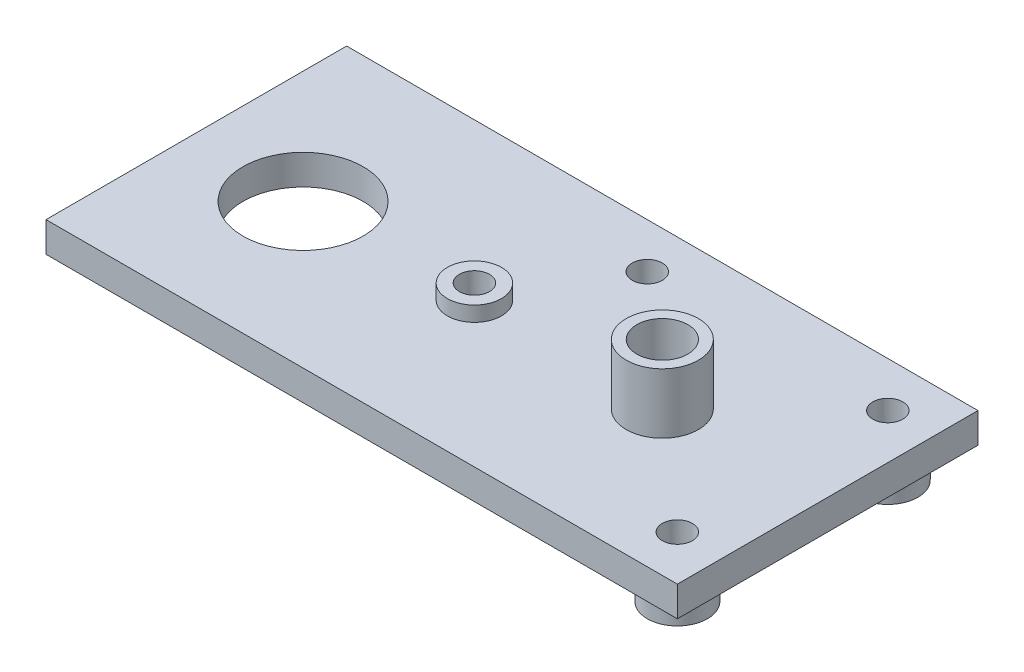
ISO-10303-21;
HEADER;
FILE_DESCRIPTION(('STEP AP214'),'2;1');
FILE_NAME('part.step','',(''),(''),'','','');
FILE_SCHEMA(('AUTOMOTIVE_DESIGN { 1 0 10303 214 1 1 1 1 }'));
ENDSEC;
DATA;
#1=APPLICATION_CONTEXT('core data for automotive mechanical design processes');
#2=APPLICATION_PROTOCOL_DEFINITION('international standard','automotive_design',2000,#1);
#3=PRODUCT_CONTEXT('',#1,'mechanical');
#4=PRODUCT('Part','Part','',(#3));
#5=PRODUCT_RELATED_PRODUCT_CATEGORY('part','',(#4));
#6=PRODUCT_DEFINITION_FORMATION('','',#4);
#7=PRODUCT_DEFINITION_CONTEXT('part definition',#1,'design');
#8=PRODUCT_DEFINITION('design','',#6,#7);
#9=PRODUCT_DEFINITION_SHAPE('','',#8);
#10=(LENGTH_UNIT() NAMED_UNIT(*) SI_UNIT(.MILLI.,.METRE.));
#11=(NAMED_UNIT(*) PLANE_ANGLE_UNIT() SI_UNIT($,.RADIAN.));
#12=(NAMED_UNIT(*) SI_UNIT($,.STERADIAN.) SOLID_ANGLE_UNIT());
#13=UNCERTAINTY_MEASURE_WITH_UNIT(LENGTH_MEASURE(1.E-05),#10,'distance_accuracy_value','');
#14=(GEOMETRIC_REPRESENTATION_CONTEXT(3) GLOBAL_UNCERTAINTY_ASSIGNED_CONTEXT((#13)) GLOBAL_UNIT_ASSIGNED_CONTEXT((#10,
#11,#12)) REPRESENTATION_CONTEXT('',''));
#15=CARTESIAN_POINT('',(0.,0.,0.));
#16=DIRECTION('',(0.,0.,1.));
#17=DIRECTION('',(1.,0.,0.));
#18=AXIS2_PLACEMENT_3D('',#15,#16,#17);
#19=CARTESIAN_POINT('',(10.5,1.,-5.));
#20=DIRECTION('',(-1.,0.,0.));
#21=DIRECTION('',(0.,0.,1.));
#22=AXIS2_PLACEMENT_3D('',#19,#20,#21);
#23=PLANE('',#22);
#24=DIRECTION('',(0.,0.,-1.));
#25=VECTOR('',#24,1.);
#26=CARTESIAN_POINT('',(10.5,0.,-5.));
#27=LINE('',#26,#25);
#28=CARTESIAN_POINT('',(10.5,0.,5.));
#29=VERTEX_POINT('',#28);
#30=CARTESIAN_POINT('',(10.5,0.,-5.));
#31=VERTEX_POINT('',#30);
#32=EDGE_CURVE('E111',#29,#31,#27,.T.);
#33=ORIENTED_EDGE('',*,*,#32,.T.);
#34=DIRECTION('',(0.,-1.,0.));
#35=VECTOR('',#34,1.);
#36=CARTESIAN_POINT('',(10.5,1.,-5.));
#37=LINE('',#36,#35);
#38=CARTESIAN_POINT('',(10.5,1.,-5.));
#39=VERTEX_POINT('',#38);
#40=EDGE_CURVE('E100',#39,#31,#37,.T.);
#41=ORIENTED_EDGE('',*,*,#40,.F.);
#42=DIRECTION('',(0.,0.,-1.));
#43=VECTOR('',#42,1.);
#44=CARTESIAN_POINT('',(10.5,1.,-5.));
#45=LINE('',#44,#43);
#46=CARTESIAN_POINT('',(10.5,1.,5.));
#47=VERTEX_POINT('',#46);
#48=EDGE_CURVE('E92',#47,#39,#45,.T.);
#49=ORIENTED_EDGE('',*,*,#48,.F.);
#50=DIRECTION('',(0.,-1.,0.));
#51=VECTOR('',#50,1.);
#52=CARTESIAN_POINT('',(10.5,1.,5.));
#53=LINE('',#52,#51);
#54=EDGE_CURVE('E107',#47,#29,#53,.T.);
#55=ORIENTED_EDGE('',*,*,#54,.T.);
#56=EDGE_LOOP('',(#33,#41,#49,#55));
#57=FACE_BOUND('',#56,.T.);
#58=ADVANCED_FACE('F39',(#57),#23,.F.);
#59=CARTESIAN_POINT('',(-10.5,1.,-5.));
#60=DIRECTION('',(0.,0.,1.));
#61=DIRECTION('',(1.,0.,0.));
#62=AXIS2_PLACEMENT_3D('',#59,#60,#61);
#63=PLANE('',#62);
#64=DIRECTION('',(-1.,0.,0.));
#65=VECTOR('',#64,1.);
#66=CARTESIAN_POINT('',(-10.5,0.,-5.));
#67=LINE('',#66,#65);
#68=CARTESIAN_POINT('',(-10.5,0.,-5.));
#69=VERTEX_POINT('',#68);
#70=EDGE_CURVE('E98',#31,#69,#67,.T.);
#71=ORIENTED_EDGE('',*,*,#70,.T.);
#72=DIRECTION('',(0.,-1.,0.));
#73=VECTOR('',#72,1.);
#74=CARTESIAN_POINT('',(-10.5,1.,-5.));
#75=LINE('',#74,#73);
#76=CARTESIAN_POINT('',(-10.5,1.,-5.));
#77=VERTEX_POINT('',#76);
#78=EDGE_CURVE('E96',#77,#69,#75,.T.);
#79=ORIENTED_EDGE('',*,*,#78,.F.);
#80=DIRECTION('',(-1.,0.,0.));
#81=VECTOR('',#80,1.);
#82=CARTESIAN_POINT('',(-10.5,1.,-5.));
#83=LINE('',#82,#81);
#84=EDGE_CURVE('E87',#39,#77,#83,.T.);
#85=ORIENTED_EDGE('',*,*,#84,.F.);
#86=ORIENTED_EDGE('',*,*,#40,.T.);
#87=EDGE_LOOP('',(#71,#79,#85,#86));
#88=FACE_BOUND('',#87,.T.);
#89=ADVANCED_FACE('F97',(#88),#63,.F.);
#90=CARTESIAN_POINT('',(-10.5,1.,-5.));
#91=DIRECTION('',(1.,0.,0.));
#92=DIRECTION('',(0.,0.,-1.));
#93=AXIS2_PLACEMENT_3D('',#90,#91,#92);
#94=PLANE('',#93);
#95=DIRECTION('',(0.,0.,1.));
#96=VECTOR('',#95,1.);
#97=CARTESIAN_POINT('',(-10.5,0.,-5.));
#98=LINE('',#97,#96);
#99=CARTESIAN_POINT('',(-10.5,0.,5.));
#100=VERTEX_POINT('',#99);
#101=EDGE_CURVE('E73',#69,#100,#98,.T.);
#102=ORIENTED_EDGE('',*,*,#101,.T.);
#103=DIRECTION('',(0.,-1.,0.));
#104=VECTOR('',#103,1.);
#105=CARTESIAN_POINT('',(-10.5,1.,5.));
#106=LINE('',#105,#104);
#107=CARTESIAN_POINT('',(-10.5,1.,5.));
#108=VERTEX_POINT('',#107);
#109=EDGE_CURVE('E101',#108,#100,#106,.T.);
#110=ORIENTED_EDGE('',*,*,#109,.F.);
#111=DIRECTION('',(0.,0.,1.));
#112=VECTOR('',#111,1.);
#113=CARTESIAN_POINT('',(-10.5,1.,-5.));
#114=LINE('',#113,#112);
#115=EDGE_CURVE('E90',#77,#108,#114,.T.);
#116=ORIENTED_EDGE('',*,*,#115,.F.);
#117=ORIENTED_EDGE('',*,*,#78,.T.);
#118=EDGE_LOOP('',(#102,#110,#116,#117));
#119=FACE_BOUND('',#118,.T.);
#120=ADVANCED_FACE('F103',(#119),#94,.F.);
#121=CARTESIAN_POINT('',(-10.5,1.,5.));
#122=DIRECTION('',(0.,0.,-1.));
#123=DIRECTION('',(-1.,0.,0.));
#124=AXIS2_PLACEMENT_3D('',#121,#122,#123);
#125=PLANE('',#124);
#126=DIRECTION('',(1.,0.,0.));
#127=VECTOR('',#126,1.);
#128=CARTESIAN_POINT('',(-10.5,0.,5.));
#129=LINE('',#128,#127);
#130=EDGE_CURVE('E79',#100,#29,#129,.T.);
#131=ORIENTED_EDGE('',*,*,#130,.T.);
#132=ORIENTED_EDGE('',*,*,#54,.F.);
#133=DIRECTION('',(1.,0.,0.));
#134=VECTOR('',#133,1.);
#135=CARTESIAN_POINT('',(-10.5,1.,5.));
#136=LINE('',#135,#134);
#137=EDGE_CURVE('E56',#108,#47,#136,.T.);
#138=ORIENTED_EDGE('',*,*,#137,.F.);
#139=ORIENTED_EDGE('',*,*,#109,.T.);
#140=EDGE_LOOP('',(#131,#132,#138,#139));
#141=FACE_BOUND('',#140,.T.);
#142=ADVANCED_FACE('F164',(#141),#125,.F.);
#143=CARTESIAN_POINT('',(0.,1.,0.));
#144=DIRECTION('',(0.,1.,0.));
#145=DIRECTION('',(0.,0.,1.));
#146=AXIS2_PLACEMENT_3D('',#143,#144,#145);
#147=PLANE('',#146);
#148=CARTESIAN_POINT('',(9.,1.,3.5));
#149=DIRECTION('',(0.,1.,0.));
#150=DIRECTION('',(0.,0.,1.));
#151=AXIS2_PLACEMENT_3D('',#148,#149,#150);
#152=CIRCLE('',#151,0.500000000000001);
#153=CARTESIAN_POINT('',(9.,1.,4.));
#154=VERTEX_POINT('',#153);
#155=EDGE_CURVE('E424',#154,#154,#152,.T.);
#156=ORIENTED_EDGE('',*,*,#155,.F.);
#157=EDGE_LOOP('',(#156));
#158=FACE_BOUND('',#157,.T.);
#159=CARTESIAN_POINT('',(0.999999999999999,1.,-3.5));
#160=DIRECTION('',(0.,1.,0.));
#161=DIRECTION('',(0.,0.,1.));
#162=AXIS2_PLACEMENT_3D('',#159,#160,#161);
#163=CIRCLE('',#162,0.5);
#164=CARTESIAN_POINT('',(0.999999999999999,1.,-3.));
#165=VERTEX_POINT('',#164);
#166=EDGE_CURVE('E428',#165,#165,#163,.T.);
#167=ORIENTED_EDGE('',*,*,#166,.F.);
#168=EDGE_LOOP('',(#167));
#169=FACE_BOUND('',#168,.T.);
#170=CARTESIAN_POINT('',(9.,1.,-3.5));
#171=DIRECTION('',(0.,1.,0.));
#172=DIRECTION('',(0.,0.,1.));
#173=AXIS2_PLACEMENT_3D('',#170,#171,#172);
#174=CIRCLE('',#173,0.500000000000001);
#175=CARTESIAN_POINT('',(9.,1.,-3.));
#176=VERTEX_POINT('',#175);
#177=EDGE_CURVE('E432',#176,#176,#174,.T.);
#178=ORIENTED_EDGE('',*,*,#177,.F.);
#179=EDGE_LOOP('',(#178));
#180=FACE_BOUND('',#179,.T.);
#181=CARTESIAN_POINT('',(-6.75,1.,0.2));
#182=DIRECTION('',(0.,1.,0.));
#183=DIRECTION('',(0.,0.,1.));
#184=AXIS2_PLACEMENT_3D('',#181,#182,#183);
#185=CIRCLE('',#184,2.);
#186=CARTESIAN_POINT('',(-6.75,1.,2.2));
#187=VERTEX_POINT('',#186);
#188=EDGE_CURVE('E439',#187,#187,#185,.T.);
#189=ORIENTED_EDGE('',*,*,#188,.F.);
#190=EDGE_LOOP('',(#189));
#191=FACE_BOUND('',#190,.T.);
#192=CARTESIAN_POINT('',(-1.05,1.,0.2));
#193=DIRECTION('',(0.,1.,0.));
#194=DIRECTION('',(0.,0.,1.));
#195=AXIS2_PLACEMENT_3D('',#192,#193,#194);
#196=CIRCLE('',#195,0.9);
#197=CARTESIAN_POINT('',(-1.05,1.,1.1));
#198=VERTEX_POINT('',#197);
#199=EDGE_CURVE('E128',#198,#198,#196,.T.);
#200=ORIENTED_EDGE('',*,*,#199,.F.);
#201=EDGE_LOOP('',(#200));
#202=FACE_BOUND('',#201,.T.);
#203=CARTESIAN_POINT('',(5.2,1.,0.2));
#204=DIRECTION('',(0.,1.,0.));
#205=DIRECTION('',(0.,0.,1.));
#206=AXIS2_PLACEMENT_3D('',#203,#204,#205);
#207=CIRCLE('',#206,1.2);
#208=CARTESIAN_POINT('',(5.2,1.,1.4));
#209=VERTEX_POINT('',#208);
#210=EDGE_CURVE('E457',#209,#209,#207,.T.);
#211=ORIENTED_EDGE('',*,*,#210,.F.);
#212=EDGE_LOOP('',(#211));
#213=FACE_BOUND('',#212,.T.);
#214=ORIENTED_EDGE('',*,*,#48,.T.);
#215=ORIENTED_EDGE('',*,*,#84,.T.);
#216=ORIENTED_EDGE('',*,*,#115,.T.);
#217=ORIENTED_EDGE('',*,*,#137,.T.);
#218=EDGE_LOOP('',(#214,#215,#216,#217));
#219=FACE_BOUND('',#218,.T.);
#220=ADVANCED_FACE('F88',(#158,#169,#180,#191,#202,#213,#219),#147,.T.);
#221=CARTESIAN_POINT('',(0.,0.,0.));
#222=DIRECTION('',(0.,1.,0.));
#223=DIRECTION('',(0.,0.,1.));
#224=AXIS2_PLACEMENT_3D('',#221,#222,#223);
#225=PLANE('',#224);
#226=CARTESIAN_POINT('',(0.999999999999999,0.,-3.5));
#227=DIRECTION('',(0.,1.,0.));
#228=DIRECTION('',(0.,0.,1.));
#229=AXIS2_PLACEMENT_3D('',#226,#227,#228);
#230=CIRCLE('',#229,1.);
#231=CARTESIAN_POINT('',(0.999999999999999,0.,-2.5));
#232=VERTEX_POINT('',#231);
#233=EDGE_CURVE('E11',#232,#232,#230,.F.);
#234=ORIENTED_EDGE('',*,*,#233,.F.);
#235=EDGE_LOOP('',(#234));
#236=FACE_BOUND('',#235,.T.);
#237=CARTESIAN_POINT('',(9.,0.,-3.5));
#238=DIRECTION('',(0.,1.,0.));
#239=DIRECTION('',(0.,0.,1.));
#240=AXIS2_PLACEMENT_3D('',#237,#238,#239);
#241=CIRCLE('',#240,1.);
#242=CARTESIAN_POINT('',(9.,0.,-2.5));
#243=VERTEX_POINT('',#242);
#244=EDGE_CURVE('E48',#243,#243,#241,.F.);
#245=ORIENTED_EDGE('',*,*,#244,.F.);
#246=EDGE_LOOP('',(#245));
#247=FACE_BOUND('',#246,.T.);
#248=CARTESIAN_POINT('',(9.,0.,3.5));
#249=DIRECTION('',(0.,1.,0.));
#250=DIRECTION('',(0.,0.,1.));
#251=AXIS2_PLACEMENT_3D('',#248,#249,#250);
#252=CIRCLE('',#251,1.);
#253=CARTESIAN_POINT('',(9.,0.,4.5));
#254=VERTEX_POINT('',#253);
#255=EDGE_CURVE('E135',#254,#254,#252,.F.);
#256=ORIENTED_EDGE('',*,*,#255,.F.);
#257=EDGE_LOOP('',(#256));
#258=FACE_BOUND('',#257,.T.);
#259=CARTESIAN_POINT('',(-6.75,0.,0.2));
#260=DIRECTION('',(0.,1.,0.));
#261=DIRECTION('',(0.,0.,1.));
#262=AXIS2_PLACEMENT_3D('',#259,#260,#261);
#263=CIRCLE('',#262,2.);
#264=CARTESIAN_POINT('',(-6.75,0.,2.2));
#265=VERTEX_POINT('',#264);
#266=EDGE_CURVE('E155',#265,#265,#263,.T.);
#267=ORIENTED_EDGE('',*,*,#266,.T.);
#268=EDGE_LOOP('',(#267));
#269=FACE_BOUND('',#268,.T.);
#270=CARTESIAN_POINT('',(-1.05,0.,0.2));
#271=DIRECTION('',(0.,1.,0.));
#272=DIRECTION('',(0.,0.,1.));
#273=AXIS2_PLACEMENT_3D('',#270,#271,#272);
#274=CIRCLE('',#273,0.9);
#275=CARTESIAN_POINT('',(-1.05,0.,1.1));
#276=VERTEX_POINT('',#275);
#277=EDGE_CURVE('E129',#276,#276,#274,.T.);
#278=ORIENTED_EDGE('',*,*,#277,.T.);
#279=EDGE_LOOP('',(#278));
#280=FACE_BOUND('',#279,.T.);
#281=CARTESIAN_POINT('',(5.2,0.,0.2));
#282=DIRECTION('',(0.,1.,0.));
#283=DIRECTION('',(0.,0.,1.));
#284=AXIS2_PLACEMENT_3D('',#281,#282,#283);
#285=CIRCLE('',#284,0.85);
#286=CARTESIAN_POINT('',(5.2,0.,1.05));
#287=VERTEX_POINT('',#286);
#288=EDGE_CURVE('E161',#287,#287,#285,.T.);
#289=ORIENTED_EDGE('',*,*,#288,.T.);
#290=EDGE_LOOP('',(#289));
#291=FACE_BOUND('',#290,.T.);
#292=ORIENTED_EDGE('',*,*,#32,.F.);
#293=ORIENTED_EDGE('',*,*,#130,.F.);
#294=ORIENTED_EDGE('',*,*,#101,.F.);
#295=ORIENTED_EDGE('',*,*,#70,.F.);
#296=EDGE_LOOP('',(#292,#293,#294,#295));
#297=FACE_BOUND('',#296,.T.);
#298=ADVANCED_FACE('F144',(#236,#247,#258,#269,#280,#291,#297),#225,.F.);
#299=CARTESIAN_POINT('',(5.2,3.,0.2));
#300=DIRECTION('',(0.,-1.,0.));
#301=DIRECTION('',(0.,0.,-1.));
#302=AXIS2_PLACEMENT_3D('',#299,#300,#301);
#303=CYLINDRICAL_SURFACE('',#302,1.2);
#304=CARTESIAN_POINT('',(5.2,3.,0.2));
#305=DIRECTION('',(0.,1.,0.));
#306=DIRECTION('',(0.,0.,1.));
#307=AXIS2_PLACEMENT_3D('',#304,#305,#306);
#308=CIRCLE('',#307,1.2);
#309=CARTESIAN_POINT('',(5.2,3.,1.4));
#310=VERTEX_POINT('',#309);
#311=EDGE_CURVE('E115',#310,#310,#308,.T.);
#312=ORIENTED_EDGE('',*,*,#311,.F.);
#313=EDGE_LOOP('',(#312));
#314=FACE_BOUND('',#313,.T.);
#315=ORIENTED_EDGE('',*,*,#210,.T.);
#316=EDGE_LOOP('',(#315));
#317=FACE_BOUND('',#316,.T.);
#318=ADVANCED_FACE('F147',(#314,#317),#303,.T.);
#319=CARTESIAN_POINT('',(5.2,3.,0.2));
#320=DIRECTION('',(0.,1.,0.));
#321=DIRECTION('',(0.,0.,1.));
#322=AXIS2_PLACEMENT_3D('',#319,#320,#321);
#323=PLANE('',#322);
#324=CARTESIAN_POINT('',(5.2,3.,0.2));
#325=DIRECTION('',(0.,1.,0.));
#326=DIRECTION('',(0.,0.,1.));
#327=AXIS2_PLACEMENT_3D('',#324,#325,#326);
#328=CIRCLE('',#327,0.85);
#329=CARTESIAN_POINT('',(5.2,3.,1.05));
#330=VERTEX_POINT('',#329);
#331=EDGE_CURVE('E133',#330,#330,#328,.T.);
#332=ORIENTED_EDGE('',*,*,#331,.F.);
#333=EDGE_LOOP('',(#332));
#334=FACE_BOUND('',#333,.T.);
#335=ORIENTED_EDGE('',*,*,#311,.T.);
#336=EDGE_LOOP('',(#335));
#337=FACE_BOUND('',#336,.T.);
#338=ADVANCED_FACE('F198',(#334,#337),#323,.T.);
#339=CARTESIAN_POINT('',(5.2,0.,0.2));
#340=DIRECTION('',(0.,1.,0.));
#341=DIRECTION('',(0.,0.,1.));
#342=AXIS2_PLACEMENT_3D('',#339,#340,#341);
#343=CYLINDRICAL_SURFACE('',#342,0.85);
#344=ORIENTED_EDGE('',*,*,#288,.F.);
#345=EDGE_LOOP('',(#344));
#346=FACE_BOUND('',#345,.T.);
#347=ORIENTED_EDGE('',*,*,#331,.T.);
#348=EDGE_LOOP('',(#347));
#349=FACE_BOUND('',#348,.T.);
#350=ADVANCED_FACE('F209',(#346,#349),#343,.F.);
#351=CARTESIAN_POINT('',(-1.05,-1.,0.2));
#352=DIRECTION('',(0.,1.,0.));
#353=DIRECTION('',(0.,0.,1.));
#354=AXIS2_PLACEMENT_3D('',#351,#352,#353);
#355=PLANE('',#354);
#356=CARTESIAN_POINT('',(-1.05,-1.,0.2));
#357=DIRECTION('',(0.,1.,0.));
#358=DIRECTION('',(0.,0.,1.));
#359=AXIS2_PLACEMENT_3D('',#356,#357,#358);
#360=CIRCLE('',#359,0.9);
#361=CARTESIAN_POINT('',(-1.05,-1.,1.1));
#362=VERTEX_POINT('',#361);
#363=EDGE_CURVE('E134',#362,#362,#360,.T.);
#364=ORIENTED_EDGE('',*,*,#363,.F.);
#365=EDGE_LOOP('',(#364));
#366=FACE_BOUND('',#365,.T.);
#367=ADVANCED_FACE('F219',(#366),#355,.F.);
#368=CARTESIAN_POINT('',(-1.05,-1.,0.2));
#369=DIRECTION('',(0.,1.,0.));
#370=DIRECTION('',(0.,0.,1.));
#371=AXIS2_PLACEMENT_3D('',#368,#369,#370);
#372=CYLINDRICAL_SURFACE('',#371,0.9);
#373=ORIENTED_EDGE('',*,*,#363,.T.);
#374=EDGE_LOOP('',(#373));
#375=FACE_BOUND('',#374,.T.);
#376=ORIENTED_EDGE('',*,*,#277,.F.);
#377=EDGE_LOOP('',(#376));
#378=FACE_BOUND('',#377,.T.);
#379=ADVANCED_FACE('F229',(#375,#378),#372,.T.);
#380=ORIENTED_EDGE('',*,*,#199,.T.);
#381=EDGE_LOOP('',(#380));
#382=FACE_BOUND('',#381,.T.);
#383=CARTESIAN_POINT('',(-1.05,1.5,0.2));
#384=DIRECTION('',(0.,1.,0.));
#385=DIRECTION('',(0.,0.,1.));
#386=AXIS2_PLACEMENT_3D('',#383,#384,#385);
#387=CIRCLE('',#386,0.9);
#388=CARTESIAN_POINT('',(-1.05,1.5,1.1));
#389=VERTEX_POINT('',#388);
#390=EDGE_CURVE('E442',#389,#389,#387,.T.);
#391=ORIENTED_EDGE('',*,*,#390,.F.);
#392=EDGE_LOOP('',(#391));
#393=FACE_BOUND('',#392,.T.);
#394=ADVANCED_FACE('F239',(#382,#393),#372,.T.);
#395=CARTESIAN_POINT('',(-1.05,1.5,0.2));
#396=DIRECTION('',(0.,1.,0.));
#397=DIRECTION('',(0.,0.,1.));
#398=AXIS2_PLACEMENT_3D('',#395,#396,#397);
#399=PLANE('',#398);
#400=CARTESIAN_POINT('',(-1.05,1.5,0.2));
#401=DIRECTION('',(0.,1.,0.));
#402=DIRECTION('',(0.,0.,1.));
#403=AXIS2_PLACEMENT_3D('',#400,#401,#402);
#404=CIRCLE('',#403,0.5);
#405=CARTESIAN_POINT('',(-1.05,1.5,0.7));
#406=VERTEX_POINT('',#405);
#407=EDGE_CURVE('E419',#406,#406,#404,.T.);
#408=ORIENTED_EDGE('',*,*,#407,.F.);
#409=EDGE_LOOP('',(#408));
#410=FACE_BOUND('',#409,.T.);
#411=ORIENTED_EDGE('',*,*,#390,.T.);
#412=EDGE_LOOP('',(#411));
#413=FACE_BOUND('',#412,.T.);
#414=ADVANCED_FACE('F249',(#410,#413),#399,.T.);
#415=CARTESIAN_POINT('',(-6.75,0.,0.2));
#416=DIRECTION('',(0.,1.,0.));
#417=DIRECTION('',(0.,0.,1.));
#418=AXIS2_PLACEMENT_3D('',#415,#416,#417);
#419=CYLINDRICAL_SURFACE('',#418,2.);
#420=ORIENTED_EDGE('',*,*,#266,.F.);
#421=EDGE_LOOP('',(#420));
#422=FACE_BOUND('',#421,.T.);
#423=ORIENTED_EDGE('',*,*,#188,.T.);
#424=EDGE_LOOP('',(#423));
#425=FACE_BOUND('',#424,.T.);
#426=ADVANCED_FACE('F256',(#422,#425),#419,.F.);
#427=CARTESIAN_POINT('',(9.,0.,-3.5));
#428=DIRECTION('',(0.,1.,0.));
#429=DIRECTION('',(0.,0.,1.));
#430=AXIS2_PLACEMENT_3D('',#427,#428,#429);
#431=CYLINDRICAL_SURFACE('',#430,0.500000000000001);
#432=ORIENTED_EDGE('',*,*,#177,.T.);
#433=EDGE_LOOP('',(#432));
#434=FACE_BOUND('',#433,.T.);
#435=CARTESIAN_POINT('',(9.,-1.,-3.5));
#436=DIRECTION('',(0.,-1.,0.));
#437=DIRECTION('',(0.,0.,-1.));
#438=AXIS2_PLACEMENT_3D('',#435,#436,#437);
#439=CIRCLE('',#438,0.500000000000001);
#440=CARTESIAN_POINT('',(9.,-1.,-4.));
#441=VERTEX_POINT('',#440);
#442=EDGE_CURVE('E411',#441,#441,#439,.T.);
#443=ORIENTED_EDGE('',*,*,#442,.T.);
#444=EDGE_LOOP('',(#443));
#445=FACE_BOUND('',#444,.T.);
#446=ADVANCED_FACE('F261',(#434,#445),#431,.F.);
#447=CARTESIAN_POINT('',(0.999999999999999,0.,-3.5));
#448=DIRECTION('',(0.,1.,0.));
#449=DIRECTION('',(0.,0.,1.));
#450=AXIS2_PLACEMENT_3D('',#447,#448,#449);
#451=CYLINDRICAL_SURFACE('',#450,0.5);
#452=ORIENTED_EDGE('',*,*,#166,.T.);
#453=EDGE_LOOP('',(#452));
#454=FACE_BOUND('',#453,.T.);
#455=CARTESIAN_POINT('',(0.999999999999999,-1.,-3.5));
#456=DIRECTION('',(0.,-1.,0.));
#457=DIRECTION('',(0.,0.,-1.));
#458=AXIS2_PLACEMENT_3D('',#455,#456,#457);
#459=CIRCLE('',#458,0.5);
#460=CARTESIAN_POINT('',(0.999999999999999,-1.,-4.));
#461=VERTEX_POINT('',#460);
#462=EDGE_CURVE('E397',#461,#461,#459,.T.);
#463=ORIENTED_EDGE('',*,*,#462,.T.);
#464=EDGE_LOOP('',(#463));
#465=FACE_BOUND('',#464,.T.);
#466=ADVANCED_FACE('F350',(#454,#465),#451,.F.);
#467=CARTESIAN_POINT('',(9.,0.,3.5));
#468=DIRECTION('',(0.,1.,0.));
#469=DIRECTION('',(0.,0.,1.));
#470=AXIS2_PLACEMENT_3D('',#467,#468,#469);
#471=CYLINDRICAL_SURFACE('',#470,0.500000000000001);
#472=ORIENTED_EDGE('',*,*,#155,.T.);
#473=EDGE_LOOP('',(#472));
#474=FACE_BOUND('',#473,.T.);
#475=CARTESIAN_POINT('',(9.,-1.,3.5));
#476=DIRECTION('',(0.,-1.,0.));
#477=DIRECTION('',(0.,0.,-1.));
#478=AXIS2_PLACEMENT_3D('',#475,#476,#477);
#479=CIRCLE('',#478,0.500000000000001);
#480=CARTESIAN_POINT('',(9.,-1.,3.));
#481=VERTEX_POINT('',#480);
#482=EDGE_CURVE('E403',#481,#481,#479,.T.);
#483=ORIENTED_EDGE('',*,*,#482,.T.);
#484=EDGE_LOOP('',(#483));
#485=FACE_BOUND('',#484,.T.);
#486=ADVANCED_FACE('F287',(#474,#485),#471,.F.);
#487=CARTESIAN_POINT('',(-1.05,-0.5,0.2));
#488=DIRECTION('',(0.,1.,0.));
#489=DIRECTION('',(0.,0.,1.));
#490=AXIS2_PLACEMENT_3D('',#487,#488,#489);
#491=CYLINDRICAL_SURFACE('',#490,0.5);
#492=CARTESIAN_POINT('',(-1.05,-0.5,0.2));
#493=DIRECTION('',(0.,1.,0.));
#494=DIRECTION('',(0.,0.,1.));
#495=AXIS2_PLACEMENT_3D('',#492,#493,#494);
#496=CIRCLE('',#495,0.5);
#497=CARTESIAN_POINT('',(-1.05,-0.5,0.7));
#498=VERTEX_POINT('',#497);
#499=EDGE_CURVE('E420',#498,#498,#496,.T.);
#500=ORIENTED_EDGE('',*,*,#499,.F.);
#501=EDGE_LOOP('',(#500));
#502=FACE_BOUND('',#501,.T.);
#503=ORIENTED_EDGE('',*,*,#407,.T.);
#504=EDGE_LOOP('',(#503));
#505=FACE_BOUND('',#504,.T.);
#506=ADVANCED_FACE('F281',(#502,#505),#491,.F.);
#507=CARTESIAN_POINT('',(-1.05,-0.5,0.2));
#508=DIRECTION('',(0.,1.,0.));
#509=DIRECTION('',(0.,0.,1.));
#510=AXIS2_PLACEMENT_3D('',#507,#508,#509);
#511=PLANE('',#510);
#512=ORIENTED_EDGE('',*,*,#499,.T.);
#513=EDGE_LOOP('',(#512));
#514=FACE_BOUND('',#513,.T.);
#515=ADVANCED_FACE('F286',(#514),#511,.T.);
#516=CARTESIAN_POINT('',(9.,-1.,3.5));
#517=DIRECTION('',(0.,1.,0.));
#518=DIRECTION('',(0.,0.,1.));
#519=AXIS2_PLACEMENT_3D('',#516,#517,#518);
#520=CYLINDRICAL_SURFACE('',#519,1.);
#521=CARTESIAN_POINT('',(9.,-1.,3.5));
#522=DIRECTION('',(0.,-1.,0.));
#523=DIRECTION('',(0.,0.,-1.));
#524=AXIS2_PLACEMENT_3D('',#521,#522,#523);
#525=CIRCLE('',#524,1.);
#526=CARTESIAN_POINT('',(9.,-1.,2.5));
#527=VERTEX_POINT('',#526);
#528=EDGE_CURVE('E408',#527,#527,#525,.T.);
#529=ORIENTED_EDGE('',*,*,#528,.F.);
#530=EDGE_LOOP('',(#529));
#531=FACE_BOUND('',#530,.T.);
#532=ORIENTED_EDGE('',*,*,#255,.T.);
#533=EDGE_LOOP('',(#532));
#534=FACE_BOUND('',#533,.T.);
#535=ADVANCED_FACE('F299',(#531,#534),#520,.T.);
#536=CARTESIAN_POINT('',(9.,-1.,3.5));
#537=DIRECTION('',(0.,-1.,0.));
#538=DIRECTION('',(0.,0.,-1.));
#539=AXIS2_PLACEMENT_3D('',#536,#537,#538);
#540=PLANE('',#539);
#541=ORIENTED_EDGE('',*,*,#482,.F.);
#542=EDGE_LOOP('',(#541));
#543=FACE_BOUND('',#542,.T.);
#544=ORIENTED_EDGE('',*,*,#528,.T.);
#545=EDGE_LOOP('',(#544));
#546=FACE_BOUND('',#545,.T.);
#547=ADVANCED_FACE('F314',(#543,#546),#540,.T.);
#548=CARTESIAN_POINT('',(9.,-1.,-3.5));
#549=DIRECTION('',(0.,1.,0.));
#550=DIRECTION('',(0.,0.,1.));
#551=AXIS2_PLACEMENT_3D('',#548,#549,#550);
#552=CYLINDRICAL_SURFACE('',#551,1.);
#553=CARTESIAN_POINT('',(9.,-1.,-3.5));
#554=DIRECTION('',(0.,-1.,0.));
#555=DIRECTION('',(0.,0.,-1.));
#556=AXIS2_PLACEMENT_3D('',#553,#554,#555);
#557=CIRCLE('',#556,1.);
#558=CARTESIAN_POINT('',(9.,-1.,-4.5));
#559=VERTEX_POINT('',#558);
#560=EDGE_CURVE('E402',#559,#559,#557,.T.);
#561=ORIENTED_EDGE('',*,*,#560,.F.);
#562=EDGE_LOOP('',(#561));
#563=FACE_BOUND('',#562,.T.);
#564=ORIENTED_EDGE('',*,*,#244,.T.);
#565=EDGE_LOOP('',(#564));
#566=FACE_BOUND('',#565,.T.);
#567=ADVANCED_FACE('F142',(#563,#566),#552,.T.);
#568=CARTESIAN_POINT('',(9.,-1.,-3.5));
#569=DIRECTION('',(0.,-1.,0.));
#570=DIRECTION('',(0.,0.,-1.));
#571=AXIS2_PLACEMENT_3D('',#568,#569,#570);
#572=PLANE('',#571);
#573=ORIENTED_EDGE('',*,*,#442,.F.);
#574=EDGE_LOOP('',(#573));
#575=FACE_BOUND('',#574,.T.);
#576=ORIENTED_EDGE('',*,*,#560,.T.);
#577=EDGE_LOOP('',(#576));
#578=FACE_BOUND('',#577,.T.);
#579=ADVANCED_FACE('F326',(#575,#578),#572,.T.);
#580=CARTESIAN_POINT('',(0.999999999999999,-1.,-3.5));
#581=DIRECTION('',(0.,1.,0.));
#582=DIRECTION('',(0.,0.,1.));
#583=AXIS2_PLACEMENT_3D('',#580,#581,#582);
#584=CYLINDRICAL_SURFACE('',#583,1.);
#585=CARTESIAN_POINT('',(0.999999999999999,-1.,-3.5));
#586=DIRECTION('',(0.,-1.,0.));
#587=DIRECTION('',(0.,0.,-1.));
#588=AXIS2_PLACEMENT_3D('',#585,#586,#587);
#589=CIRCLE('',#588,1.);
#590=CARTESIAN_POINT('',(0.999999999999999,-1.,-4.5));
#591=VERTEX_POINT('',#590);
#592=EDGE_CURVE('E400',#591,#591,#589,.T.);
#593=ORIENTED_EDGE('',*,*,#592,.F.);
#594=EDGE_LOOP('',(#593));
#595=FACE_BOUND('',#594,.T.);
#596=ORIENTED_EDGE('',*,*,#233,.T.);
#597=EDGE_LOOP('',(#596));
#598=FACE_BOUND('',#597,.T.);
#599=ADVANCED_FACE('F334',(#595,#598),#584,.T.);
#600=CARTESIAN_POINT('',(0.999999999999999,-1.,-3.5));
#601=DIRECTION('',(0.,-1.,0.));
#602=DIRECTION('',(0.,0.,-1.));
#603=AXIS2_PLACEMENT_3D('',#600,#601,#602);
#604=PLANE('',#603);
#605=ORIENTED_EDGE('',*,*,#462,.F.);
#606=EDGE_LOOP('',(#605));
#607=FACE_BOUND('',#606,.T.);
#608=ORIENTED_EDGE('',*,*,#592,.T.);
#609=EDGE_LOOP('',(#608));
#610=FACE_BOUND('',#609,.T.);
#611=ADVANCED_FACE('F339',(#607,#610),#604,.T.);
#612=CLOSED_SHELL('',(#58,#89,#120,#142,#220,#298,#318,#338,#350,#367,#379,#394,#414,#426,#446,
#466,#486,#506,#515,#535,#547,#567,#579,#599,#611));
#613=MANIFOLD_SOLID_BREP('B2',#612);
#614=ADVANCED_BREP_SHAPE_REPRESENTATION('',(#18,#613),#14);
#615=SHAPE_DEFINITION_REPRESENTATION(#9,#614);
ENDSEC;
END-ISO-10303-21;
